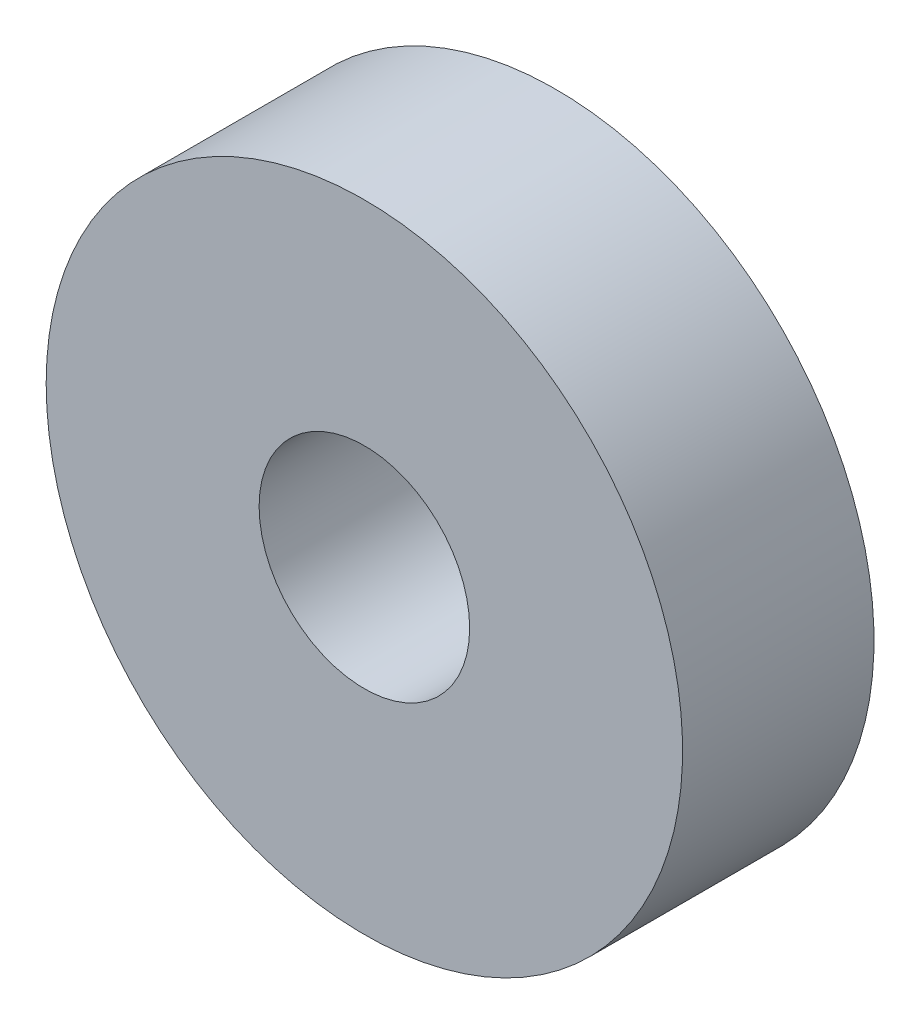
ISO-10303-21;
HEADER;
FILE_DESCRIPTION(('STEP AP214'),'2;1');
FILE_NAME('part.step','',(''),(''),'','','');
FILE_SCHEMA(('AUTOMOTIVE_DESIGN { 1 0 10303 214 1 1 1 1 }'));
ENDSEC;
DATA;
#1=APPLICATION_CONTEXT('core data for automotive mechanical design processes');
#2=APPLICATION_PROTOCOL_DEFINITION('international standard','automotive_design',2000,#1);
#3=PRODUCT_CONTEXT('',#1,'mechanical');
#4=PRODUCT('Part','Part','',(#3));
#5=PRODUCT_RELATED_PRODUCT_CATEGORY('part','',(#4));
#6=PRODUCT_DEFINITION_FORMATION('','',#4);
#7=PRODUCT_DEFINITION_CONTEXT('part definition',#1,'design');
#8=PRODUCT_DEFINITION('design','',#6,#7);
#9=PRODUCT_DEFINITION_SHAPE('','',#8);
#10=(LENGTH_UNIT() NAMED_UNIT(*) SI_UNIT(.MILLI.,.METRE.));
#11=(NAMED_UNIT(*) PLANE_ANGLE_UNIT() SI_UNIT($,.RADIAN.));
#12=(NAMED_UNIT(*) SI_UNIT($,.STERADIAN.) SOLID_ANGLE_UNIT());
#13=UNCERTAINTY_MEASURE_WITH_UNIT(LENGTH_MEASURE(1.E-05),#10,'distance_accuracy_value','');
#14=(GEOMETRIC_REPRESENTATION_CONTEXT(3) GLOBAL_UNCERTAINTY_ASSIGNED_CONTEXT((#13)) GLOBAL_UNIT_ASSIGNED_CONTEXT((#10,
#11,#12)) REPRESENTATION_CONTEXT('',''));
#15=CARTESIAN_POINT('',(0.,0.,0.));
#16=DIRECTION('',(0.,0.,1.));
#17=DIRECTION('',(1.,0.,0.));
#18=AXIS2_PLACEMENT_3D('',#15,#16,#17);
#19=CARTESIAN_POINT('',(0.,0.,3.));
#20=DIRECTION('',(0.,0.,-1.));
#21=DIRECTION('',(-1.,0.,0.));
#22=AXIS2_PLACEMENT_3D('',#19,#20,#21);
#23=CYLINDRICAL_SURFACE('',#22,4.98716201229748);
#24=CARTESIAN_POINT('',(0.,0.,3.));
#25=DIRECTION('',(0.,0.,-1.));
#26=DIRECTION('',(-1.,0.,0.));
#27=AXIS2_PLACEMENT_3D('',#24,#25,#26);
#28=CIRCLE('',#27,4.98716201229748);
#29=CARTESIAN_POINT('',(-4.98716201229748,0.,3.));
#30=VERTEX_POINT('',#29);
#31=EDGE_CURVE('E10',#30,#30,#28,.T.);
#32=ORIENTED_EDGE('',*,*,#31,.T.);
#33=EDGE_LOOP('',(#32));
#34=FACE_BOUND('',#33,.T.);
#35=CARTESIAN_POINT('',(0.,0.,0.));
#36=DIRECTION('',(0.,0.,-1.));
#37=DIRECTION('',(-1.,0.,0.));
#38=AXIS2_PLACEMENT_3D('',#35,#36,#37);
#39=CIRCLE('',#38,4.98716201229748);
#40=CARTESIAN_POINT('',(-4.98716201229748,0.,0.));
#41=VERTEX_POINT('',#40);
#42=EDGE_CURVE('E43',#41,#41,#39,.T.);
#43=ORIENTED_EDGE('',*,*,#42,.F.);
#44=EDGE_LOOP('',(#43));
#45=FACE_BOUND('',#44,.T.);
#46=ADVANCED_FACE('F37',(#34,#45),#23,.T.);
#47=CARTESIAN_POINT('',(4.98716201229748,0.,3.));
#48=DIRECTION('',(0.,0.,1.));
#49=DIRECTION('',(1.,0.,0.));
#50=AXIS2_PLACEMENT_3D('',#47,#48,#49);
#51=PLANE('',#50);
#52=CARTESIAN_POINT('',(0.,0.,3.));
#53=DIRECTION('',(0.,0.,1.));
#54=DIRECTION('',(1.,0.,0.));
#55=AXIS2_PLACEMENT_3D('',#52,#53,#54);
#56=CIRCLE('',#55,1.65);
#57=CARTESIAN_POINT('',(1.65,0.,3.));
#58=VERTEX_POINT('',#57);
#59=EDGE_CURVE('E51',#58,#58,#56,.T.);
#60=ORIENTED_EDGE('',*,*,#59,.F.);
#61=EDGE_LOOP('',(#60));
#62=FACE_BOUND('',#61,.T.);
#63=ORIENTED_EDGE('',*,*,#31,.F.);
#64=EDGE_LOOP('',(#63));
#65=FACE_BOUND('',#64,.T.);
#66=ADVANCED_FACE('F59',(#62,#65),#51,.T.);
#67=CARTESIAN_POINT('',(1.35,0.,0.));
#68=DIRECTION('',(0.,0.,-1.));
#69=DIRECTION('',(-1.,0.,0.));
#70=AXIS2_PLACEMENT_3D('',#67,#68,#69);
#71=PLANE('',#70);
#72=CARTESIAN_POINT('',(0.,0.,0.));
#73=DIRECTION('',(0.,0.,1.));
#74=DIRECTION('',(1.,0.,0.));
#75=AXIS2_PLACEMENT_3D('',#72,#73,#74);
#76=CIRCLE('',#75,1.65);
#77=CARTESIAN_POINT('',(1.65,0.,0.));
#78=VERTEX_POINT('',#77);
#79=EDGE_CURVE('E47',#78,#78,#76,.T.);
#80=ORIENTED_EDGE('',*,*,#79,.T.);
#81=EDGE_LOOP('',(#80));
#82=FACE_BOUND('',#81,.T.);
#83=ORIENTED_EDGE('',*,*,#42,.T.);
#84=EDGE_LOOP('',(#83));
#85=FACE_BOUND('',#84,.T.);
#86=ADVANCED_FACE('F62',(#82,#85),#71,.T.);
#87=CARTESIAN_POINT('',(0.,0.,0.));
#88=DIRECTION('',(0.,0.,1.));
#89=DIRECTION('',(1.,0.,0.));
#90=AXIS2_PLACEMENT_3D('',#87,#88,#89);
#91=CYLINDRICAL_SURFACE('',#90,1.65);
#92=ORIENTED_EDGE('',*,*,#79,.F.);
#93=EDGE_LOOP('',(#92));
#94=FACE_BOUND('',#93,.T.);
#95=ORIENTED_EDGE('',*,*,#59,.T.);
#96=EDGE_LOOP('',(#95));
#97=FACE_BOUND('',#96,.T.);
#98=ADVANCED_FACE('F57',(#94,#97),#91,.F.);
#99=CLOSED_SHELL('',(#46,#66,#86,#98));
#100=MANIFOLD_SOLID_BREP('B2',#99);
#101=ADVANCED_BREP_SHAPE_REPRESENTATION('',(#18,#100),#14);
#102=SHAPE_DEFINITION_REPRESENTATION(#9,#101);
ENDSEC;
END-ISO-10303-21;
